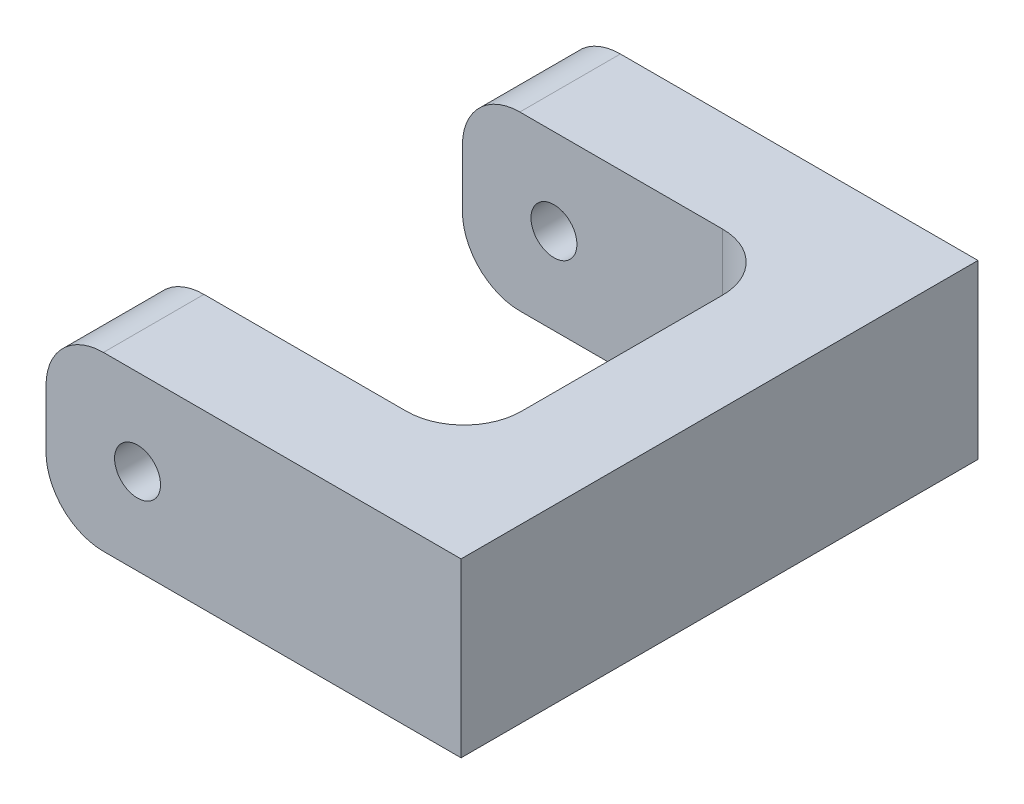
ISO-10303-21;
HEADER;
FILE_DESCRIPTION(('STEP AP214'),'2;1');
FILE_NAME('part.step','',(''),(''),'','','');
FILE_SCHEMA(('AUTOMOTIVE_DESIGN { 1 0 10303 214 1 1 1 1 }'));
ENDSEC;
DATA;
#1=APPLICATION_CONTEXT('core data for automotive mechanical design processes');
#2=APPLICATION_PROTOCOL_DEFINITION('international standard','automotive_design',2000,#1);
#3=PRODUCT_CONTEXT('',#1,'mechanical');
#4=PRODUCT('Part','Part','',(#3));
#5=PRODUCT_RELATED_PRODUCT_CATEGORY('part','',(#4));
#6=PRODUCT_DEFINITION_FORMATION('','',#4);
#7=PRODUCT_DEFINITION_CONTEXT('part definition',#1,'design');
#8=PRODUCT_DEFINITION('design','',#6,#7);
#9=PRODUCT_DEFINITION_SHAPE('','',#8);
#10=(LENGTH_UNIT() NAMED_UNIT(*) SI_UNIT(.MILLI.,.METRE.));
#11=(NAMED_UNIT(*) PLANE_ANGLE_UNIT() SI_UNIT($,.RADIAN.));
#12=(NAMED_UNIT(*) SI_UNIT($,.STERADIAN.) SOLID_ANGLE_UNIT());
#13=UNCERTAINTY_MEASURE_WITH_UNIT(LENGTH_MEASURE(1.E-05),#10,'distance_accuracy_value','');
#14=(GEOMETRIC_REPRESENTATION_CONTEXT(3) GLOBAL_UNCERTAINTY_ASSIGNED_CONTEXT((#13)) GLOBAL_UNIT_ASSIGNED_CONTEXT((#10,
#11,#12)) REPRESENTATION_CONTEXT('',''));
#15=CARTESIAN_POINT('',(0.,0.,0.));
#16=DIRECTION('',(0.,0.,1.));
#17=DIRECTION('',(1.,0.,0.));
#18=AXIS2_PLACEMENT_3D('',#15,#16,#17);
#19=CARTESIAN_POINT('',(9.88514391780015,-4.0419007614435,-71.));
#20=DIRECTION('',(0.,0.,1.));
#21=DIRECTION('',(1.,0.,0.));
#22=AXIS2_PLACEMENT_3D('',#19,#20,#21);
#23=CYLINDRICAL_SURFACE('',#22,10.);
#24=CARTESIAN_POINT('',(9.88514391780015,-4.0419007614435,-53.5));
#25=DIRECTION('',(0.,0.,-1.));
#26=DIRECTION('',(-1.,0.,0.));
#27=AXIS2_PLACEMENT_3D('',#24,#25,#26);
#28=CIRCLE('',#27,10.);
#29=CARTESIAN_POINT('',(9.88514391780022,5.9580992385565,-53.5));
#30=VERTEX_POINT('',#29);
#31=CARTESIAN_POINT('',(-0.11485608219985,-4.04190076144357,-53.5));
#32=VERTEX_POINT('',#31);
#33=EDGE_CURVE('E210',#30,#32,#28,.F.);
#34=ORIENTED_EDGE('',*,*,#33,.F.);
#35=DIRECTION('',(0.,0.,1.));
#36=VECTOR('',#35,1.);
#37=CARTESIAN_POINT('',(9.88514391780022,5.9580992385565,-71.));
#38=LINE('',#37,#36);
#39=CARTESIAN_POINT('',(9.88514391780022,5.9580992385565,-71.));
#40=VERTEX_POINT('',#39);
#41=EDGE_CURVE('E142',#40,#30,#38,.T.);
#42=ORIENTED_EDGE('',*,*,#41,.F.);
#43=CARTESIAN_POINT('',(9.88514391780015,-4.0419007614435,-71.));
#44=DIRECTION('',(0.,0.,1.));
#45=DIRECTION('',(-1.,0.,0.));
#46=AXIS2_PLACEMENT_3D('',#43,#44,#45);
#47=CIRCLE('',#46,10.);
#48=CARTESIAN_POINT('',(-0.11485608219985,-4.04190076144357,-71.));
#49=VERTEX_POINT('',#48);
#50=EDGE_CURVE('E217',#40,#49,#47,.T.);
#51=ORIENTED_EDGE('',*,*,#50,.T.);
#52=DIRECTION('',(0.,0.,1.));
#53=VECTOR('',#52,1.);
#54=CARTESIAN_POINT('',(-0.11485608219985,-4.04190076144357,-71.));
#55=LINE('',#54,#53);
#56=EDGE_CURVE('E158',#49,#32,#55,.T.);
#57=ORIENTED_EDGE('',*,*,#56,.T.);
#58=EDGE_LOOP('',(#34,#42,#51,#57));
#59=FACE_BOUND('',#58,.T.);
#60=ADVANCED_FACE('F30',(#59),#23,.T.);
#61=CARTESIAN_POINT('',(9.88514391780015,-14.0419007614435,-71.));
#62=DIRECTION('',(0.,0.,1.));
#63=DIRECTION('',(1.,0.,0.));
#64=AXIS2_PLACEMENT_3D('',#61,#62,#63);
#65=CYLINDRICAL_SURFACE('',#64,10.);
#66=CARTESIAN_POINT('',(9.88514391780015,-14.0419007614435,-53.5));
#67=DIRECTION('',(0.,0.,-1.));
#68=DIRECTION('',(-1.,0.,0.));
#69=AXIS2_PLACEMENT_3D('',#66,#67,#68);
#70=CIRCLE('',#69,10.);
#71=CARTESIAN_POINT('',(-0.114856082199849,-14.0419007614434,-53.5));
#72=VERTEX_POINT('',#71);
#73=CARTESIAN_POINT('',(9.88514391780022,-24.0419007614435,-53.5));
#74=VERTEX_POINT('',#73);
#75=EDGE_CURVE('E208',#72,#74,#70,.F.);
#76=ORIENTED_EDGE('',*,*,#75,.F.);
#77=DIRECTION('',(0.,0.,1.));
#78=VECTOR('',#77,1.);
#79=CARTESIAN_POINT('',(-0.114856082199849,-14.0419007614434,-71.));
#80=LINE('',#79,#78);
#81=CARTESIAN_POINT('',(-0.114856082199849,-14.0419007614434,-71.));
#82=VERTEX_POINT('',#81);
#83=EDGE_CURVE('E167',#82,#72,#80,.T.);
#84=ORIENTED_EDGE('',*,*,#83,.F.);
#85=CARTESIAN_POINT('',(9.88514391780015,-14.0419007614435,-71.));
#86=DIRECTION('',(0.,0.,1.));
#87=DIRECTION('',(1.,0.,0.));
#88=AXIS2_PLACEMENT_3D('',#85,#86,#87);
#89=CIRCLE('',#88,10.);
#90=CARTESIAN_POINT('',(9.88514391780022,-24.0419007614435,-71.));
#91=VERTEX_POINT('',#90);
#92=EDGE_CURVE('E224',#82,#91,#89,.T.);
#93=ORIENTED_EDGE('',*,*,#92,.T.);
#94=DIRECTION('',(0.,0.,1.));
#95=VECTOR('',#94,1.);
#96=CARTESIAN_POINT('',(9.88514391780022,-24.0419007614435,-71.));
#97=LINE('',#96,#95);
#98=EDGE_CURVE('E249',#91,#74,#97,.T.);
#99=ORIENTED_EDGE('',*,*,#98,.T.);
#100=EDGE_LOOP('',(#76,#84,#93,#99));
#101=FACE_BOUND('',#100,.T.);
#102=ADVANCED_FACE('F292',(#101),#65,.T.);
#103=CARTESIAN_POINT('',(-0.11485608219985,-4.04190076144357,-71.));
#104=DIRECTION('',(-1.,0.,0.));
#105=DIRECTION('',(0.,-1.,0.));
#106=AXIS2_PLACEMENT_3D('',#103,#104,#105);
#107=PLANE('',#106);
#108=DIRECTION('',(0.,-1.,0.));
#109=VECTOR('',#108,1.);
#110=CARTESIAN_POINT('',(-0.11485608219985,-4.04190076144357,-53.5));
#111=LINE('',#110,#109);
#112=EDGE_CURVE('E141',#32,#72,#111,.T.);
#113=ORIENTED_EDGE('',*,*,#112,.F.);
#114=ORIENTED_EDGE('',*,*,#56,.F.);
#115=DIRECTION('',(0.,-1.,0.));
#116=VECTOR('',#115,1.);
#117=CARTESIAN_POINT('',(-0.11485608219985,-4.04190076144357,-71.));
#118=LINE('',#117,#116);
#119=EDGE_CURVE('E220',#49,#82,#118,.T.);
#120=ORIENTED_EDGE('',*,*,#119,.T.);
#121=ORIENTED_EDGE('',*,*,#83,.T.);
#122=EDGE_LOOP('',(#113,#114,#120,#121));
#123=FACE_BOUND('',#122,.T.);
#124=ADVANCED_FACE('F298',(#123),#107,.T.);
#125=CARTESIAN_POINT('',(9.88514391780015,-4.0419007614435,1.5));
#126=DIRECTION('',(0.,0.,1.));
#127=DIRECTION('',(1.,0.,0.));
#128=AXIS2_PLACEMENT_3D('',#125,#126,#127);
#129=CIRCLE('',#128,10.);
#130=CARTESIAN_POINT('',(-0.11485608219985,-4.04190076144357,1.50000000000002));
#131=VERTEX_POINT('',#130);
#132=CARTESIAN_POINT('',(9.88514391780022,5.9580992385565,1.5));
#133=VERTEX_POINT('',#132);
#134=EDGE_CURVE('E134',#131,#133,#129,.F.);
#135=ORIENTED_EDGE('',*,*,#134,.F.);
#136=CARTESIAN_POINT('',(-0.11485608219985,-4.04190076144357,19.));
#137=VERTEX_POINT('',#136);
#138=EDGE_CURVE('E148',#131,#137,#55,.T.);
#139=ORIENTED_EDGE('',*,*,#138,.T.);
#140=CARTESIAN_POINT('',(9.88514391780015,-4.0419007614435,19.));
#141=DIRECTION('',(0.,0.,1.));
#142=DIRECTION('',(-1.,0.,0.));
#143=AXIS2_PLACEMENT_3D('',#140,#141,#142);
#144=CIRCLE('',#143,10.);
#145=CARTESIAN_POINT('',(9.88514391780022,5.9580992385565,19.));
#146=VERTEX_POINT('',#145);
#147=EDGE_CURVE('E201',#146,#137,#144,.T.);
#148=ORIENTED_EDGE('',*,*,#147,.F.);
#149=EDGE_CURVE('E150',#133,#146,#38,.T.);
#150=ORIENTED_EDGE('',*,*,#149,.F.);
#151=EDGE_LOOP('',(#135,#139,#148,#150));
#152=FACE_BOUND('',#151,.T.);
#153=ADVANCED_FACE('F146',(#152),#23,.T.);
#154=CARTESIAN_POINT('',(9.88514391780022,5.9580992385565,-71.));
#155=DIRECTION('',(0.,1.,0.));
#156=DIRECTION('',(0.,0.,1.));
#157=AXIS2_PLACEMENT_3D('',#154,#155,#156);
#158=PLANE('',#157);
#159=DIRECTION('',(-1.,0.,0.));
#160=VECTOR('',#159,1.);
#161=CARTESIAN_POINT('',(9.88514391780022,5.9580992385565,-53.5));
#162=LINE('',#161,#160);
#163=CARTESIAN_POINT('',(45.1526975354639,5.9580992385565,-53.5));
#164=VERTEX_POINT('',#163);
#165=EDGE_CURVE('E197',#164,#30,#162,.T.);
#166=ORIENTED_EDGE('',*,*,#165,.F.);
#167=CARTESIAN_POINT('',(45.1526975354639,5.9580992385565,-43.5));
#168=DIRECTION('',(0.,1.,0.));
#169=DIRECTION('',(0.,0.,1.));
#170=AXIS2_PLACEMENT_3D('',#167,#168,#169);
#171=CIRCLE('',#170,10.);
#172=CARTESIAN_POINT('',(55.1526975354639,5.9580992385565,-43.5));
#173=VERTEX_POINT('',#172);
#174=EDGE_CURVE('E38',#164,#173,#171,.F.);
#175=ORIENTED_EDGE('',*,*,#174,.T.);
#176=DIRECTION('',(0.,0.,-1.));
#177=VECTOR('',#176,1.);
#178=CARTESIAN_POINT('',(55.1526975354639,5.9580992385565,-71.));
#179=LINE('',#178,#177);
#180=CARTESIAN_POINT('',(55.1526975354639,5.9580992385565,-8.5));
#181=VERTEX_POINT('',#180);
#182=EDGE_CURVE('E195',#181,#173,#179,.T.);
#183=ORIENTED_EDGE('',*,*,#182,.F.);
#184=CARTESIAN_POINT('',(45.1526975354639,5.9580992385565,-8.5));
#185=DIRECTION('',(0.,1.,0.));
#186=DIRECTION('',(0.,0.,1.));
#187=AXIS2_PLACEMENT_3D('',#184,#185,#186);
#188=CIRCLE('',#187,10.);
#189=CARTESIAN_POINT('',(45.1526975354639,5.9580992385565,1.5));
#190=VERTEX_POINT('',#189);
#191=EDGE_CURVE('E187',#181,#190,#188,.F.);
#192=ORIENTED_EDGE('',*,*,#191,.T.);
#193=DIRECTION('',(1.,0.,0.));
#194=VECTOR('',#193,1.);
#195=CARTESIAN_POINT('',(9.88514391780023,5.9580992385565,1.5));
#196=LINE('',#195,#194);
#197=EDGE_CURVE('E151',#133,#190,#196,.T.);
#198=ORIENTED_EDGE('',*,*,#197,.F.);
#199=ORIENTED_EDGE('',*,*,#149,.T.);
#200=DIRECTION('',(-1.,0.,0.));
#201=VECTOR('',#200,1.);
#202=CARTESIAN_POINT('',(9.88514391780022,5.9580992385565,19.));
#203=LINE('',#202,#201);
#204=CARTESIAN_POINT('',(72.1526975354639,5.9580992385565,19.));
#205=VERTEX_POINT('',#204);
#206=EDGE_CURVE('E221',#205,#146,#203,.T.);
#207=ORIENTED_EDGE('',*,*,#206,.F.);
#208=DIRECTION('',(0.,0.,1.));
#209=VECTOR('',#208,1.);
#210=CARTESIAN_POINT('',(72.1526975354639,5.9580992385565,-71.));
#211=LINE('',#210,#209);
#212=CARTESIAN_POINT('',(72.1526975354639,5.9580992385565,-71.));
#213=VERTEX_POINT('',#212);
#214=EDGE_CURVE('E246',#213,#205,#211,.T.);
#215=ORIENTED_EDGE('',*,*,#214,.F.);
#216=DIRECTION('',(-1.,0.,0.));
#217=VECTOR('',#216,1.);
#218=CARTESIAN_POINT('',(9.88514391780022,5.9580992385565,-71.));
#219=LINE('',#218,#217);
#220=EDGE_CURVE('E159',#213,#40,#219,.T.);
#221=ORIENTED_EDGE('',*,*,#220,.T.);
#222=ORIENTED_EDGE('',*,*,#41,.T.);
#223=EDGE_LOOP('',(#166,#175,#183,#192,#198,#199,#207,#215,#221,#222));
#224=FACE_BOUND('',#223,.T.);
#225=ADVANCED_FACE('F194',(#224),#158,.T.);
#226=CARTESIAN_POINT('',(72.1526975354639,5.9580992385565,-71.));
#227=DIRECTION('',(1.,0.,0.));
#228=DIRECTION('',(0.,0.,-1.));
#229=AXIS2_PLACEMENT_3D('',#226,#227,#228);
#230=PLANE('',#229);
#231=DIRECTION('',(0.,1.,0.));
#232=VECTOR('',#231,1.);
#233=CARTESIAN_POINT('',(72.1526975354639,5.9580992385565,19.));
#234=LINE('',#233,#232);
#235=CARTESIAN_POINT('',(72.1526975354639,-24.0419007614435,19.));
#236=VERTEX_POINT('',#235);
#237=EDGE_CURVE('E240',#236,#205,#234,.T.);
#238=ORIENTED_EDGE('',*,*,#237,.F.);
#239=DIRECTION('',(0.,0.,1.));
#240=VECTOR('',#239,1.);
#241=CARTESIAN_POINT('',(72.1526975354639,-24.0419007614435,-71.));
#242=LINE('',#241,#240);
#243=CARTESIAN_POINT('',(72.1526975354639,-24.0419007614435,-71.));
#244=VERTEX_POINT('',#243);
#245=EDGE_CURVE('E248',#244,#236,#242,.T.);
#246=ORIENTED_EDGE('',*,*,#245,.F.);
#247=DIRECTION('',(0.,1.,0.));
#248=VECTOR('',#247,1.);
#249=CARTESIAN_POINT('',(72.1526975354639,5.9580992385565,-71.));
#250=LINE('',#249,#248);
#251=EDGE_CURVE('E164',#244,#213,#250,.T.);
#252=ORIENTED_EDGE('',*,*,#251,.T.);
#253=ORIENTED_EDGE('',*,*,#214,.T.);
#254=EDGE_LOOP('',(#238,#246,#252,#253));
#255=FACE_BOUND('',#254,.T.);
#256=ADVANCED_FACE('F306',(#255),#230,.T.);
#257=CARTESIAN_POINT('',(9.88514391780022,-24.0419007614435,-71.));
#258=DIRECTION('',(0.,-1.,0.));
#259=DIRECTION('',(0.,0.,-1.));
#260=AXIS2_PLACEMENT_3D('',#257,#258,#259);
#261=PLANE('',#260);
#262=DIRECTION('',(1.,0.,0.));
#263=VECTOR('',#262,1.);
#264=CARTESIAN_POINT('',(9.88514391780022,-24.0419007614435,-53.5));
#265=LINE('',#264,#263);
#266=CARTESIAN_POINT('',(45.1526975354639,-24.0419007614435,-53.5));
#267=VERTEX_POINT('',#266);
#268=EDGE_CURVE('E206',#74,#267,#265,.T.);
#269=ORIENTED_EDGE('',*,*,#268,.F.);
#270=ORIENTED_EDGE('',*,*,#98,.F.);
#271=DIRECTION('',(1.,0.,0.));
#272=VECTOR('',#271,1.);
#273=CARTESIAN_POINT('',(9.88514391780022,-24.0419007614435,-71.));
#274=LINE('',#273,#272);
#275=EDGE_CURVE('E227',#91,#244,#274,.T.);
#276=ORIENTED_EDGE('',*,*,#275,.T.);
#277=ORIENTED_EDGE('',*,*,#245,.T.);
#278=DIRECTION('',(1.,0.,0.));
#279=VECTOR('',#278,1.);
#280=CARTESIAN_POINT('',(9.88514391780022,-24.0419007614435,19.));
#281=LINE('',#280,#279);
#282=CARTESIAN_POINT('',(9.88514391780022,-24.0419007614435,19.));
#283=VERTEX_POINT('',#282);
#284=EDGE_CURVE('E237',#283,#236,#281,.T.);
#285=ORIENTED_EDGE('',*,*,#284,.F.);
#286=CARTESIAN_POINT('',(9.88514391780022,-24.0419007614435,1.5));
#287=VERTEX_POINT('',#286);
#288=EDGE_CURVE('E250',#287,#283,#97,.T.);
#289=ORIENTED_EDGE('',*,*,#288,.F.);
#290=DIRECTION('',(-1.,0.,0.));
#291=VECTOR('',#290,1.);
#292=CARTESIAN_POINT('',(9.88514391780023,-24.0419007614435,1.5));
#293=LINE('',#292,#291);
#294=CARTESIAN_POINT('',(45.1526975354639,-24.0419007614435,1.5));
#295=VERTEX_POINT('',#294);
#296=EDGE_CURVE('E152',#295,#287,#293,.T.);
#297=ORIENTED_EDGE('',*,*,#296,.F.);
#298=CARTESIAN_POINT('',(45.1526975354639,-24.0419007614435,-8.5));
#299=DIRECTION('',(0.,-1.,0.));
#300=DIRECTION('',(0.,0.,-1.));
#301=AXIS2_PLACEMENT_3D('',#298,#299,#300);
#302=CIRCLE('',#301,10.);
#303=CARTESIAN_POINT('',(55.1526975354639,-24.0419007614435,-8.5));
#304=VERTEX_POINT('',#303);
#305=EDGE_CURVE('E189',#295,#304,#302,.F.);
#306=ORIENTED_EDGE('',*,*,#305,.T.);
#307=DIRECTION('',(0.,0.,1.));
#308=VECTOR('',#307,1.);
#309=CARTESIAN_POINT('',(55.1526975354639,-24.0419007614435,-71.));
#310=LINE('',#309,#308);
#311=CARTESIAN_POINT('',(55.1526975354639,-24.0419007614435,-43.5));
#312=VERTEX_POINT('',#311);
#313=EDGE_CURVE('E171',#312,#304,#310,.T.);
#314=ORIENTED_EDGE('',*,*,#313,.F.);
#315=CARTESIAN_POINT('',(45.1526975354639,-24.0419007614435,-43.5));
#316=DIRECTION('',(0.,-1.,0.));
#317=DIRECTION('',(0.,0.,-1.));
#318=AXIS2_PLACEMENT_3D('',#315,#316,#317);
#319=CIRCLE('',#318,10.);
#320=EDGE_CURVE('E11',#312,#267,#319,.F.);
#321=ORIENTED_EDGE('',*,*,#320,.T.);
#322=EDGE_LOOP('',(#269,#270,#276,#277,#285,#289,#297,#306,#314,#321));
#323=FACE_BOUND('',#322,.T.);
#324=ADVANCED_FACE('F318',(#323),#261,.T.);
#325=CARTESIAN_POINT('',(9.88514391780015,-14.0419007614435,1.5));
#326=DIRECTION('',(0.,0.,1.));
#327=DIRECTION('',(1.,0.,0.));
#328=AXIS2_PLACEMENT_3D('',#325,#326,#327);
#329=CIRCLE('',#328,10.);
#330=CARTESIAN_POINT('',(-0.114856082199849,-14.0419007614434,1.49999999999999));
#331=VERTEX_POINT('',#330);
#332=EDGE_CURVE('E137',#287,#331,#329,.F.);
#333=ORIENTED_EDGE('',*,*,#332,.F.);
#334=ORIENTED_EDGE('',*,*,#288,.T.);
#335=CARTESIAN_POINT('',(9.88514391780015,-14.0419007614435,19.));
#336=DIRECTION('',(0.,0.,1.));
#337=DIRECTION('',(1.,0.,0.));
#338=AXIS2_PLACEMENT_3D('',#335,#336,#337);
#339=CIRCLE('',#338,10.);
#340=CARTESIAN_POINT('',(-0.114856082199849,-14.0419007614434,19.));
#341=VERTEX_POINT('',#340);
#342=EDGE_CURVE('E234',#341,#283,#339,.T.);
#343=ORIENTED_EDGE('',*,*,#342,.F.);
#344=EDGE_CURVE('E162',#331,#341,#80,.T.);
#345=ORIENTED_EDGE('',*,*,#344,.F.);
#346=EDGE_LOOP('',(#333,#334,#343,#345));
#347=FACE_BOUND('',#346,.T.);
#348=ADVANCED_FACE('F259',(#347),#65,.T.);
#349=DIRECTION('',(0.,1.,0.));
#350=VECTOR('',#349,1.);
#351=CARTESIAN_POINT('',(-0.11485608219985,-4.04190076144357,1.50000000000002));
#352=LINE('',#351,#350);
#353=EDGE_CURVE('E130',#331,#131,#352,.T.);
#354=ORIENTED_EDGE('',*,*,#353,.F.);
#355=ORIENTED_EDGE('',*,*,#344,.T.);
#356=DIRECTION('',(0.,-1.,0.));
#357=VECTOR('',#356,1.);
#358=CARTESIAN_POINT('',(-0.11485608219985,-4.04190076144357,19.));
#359=LINE('',#358,#357);
#360=EDGE_CURVE('E156',#137,#341,#359,.T.);
#361=ORIENTED_EDGE('',*,*,#360,.F.);
#362=ORIENTED_EDGE('',*,*,#138,.F.);
#363=EDGE_LOOP('',(#354,#355,#361,#362));
#364=FACE_BOUND('',#363,.T.);
#365=ADVANCED_FACE('F154',(#364),#107,.T.);
#366=CARTESIAN_POINT('',(9.88514391780015,-4.0419007614435,-71.));
#367=DIRECTION('',(0.,0.,-1.));
#368=DIRECTION('',(-1.,0.,0.));
#369=AXIS2_PLACEMENT_3D('',#366,#367,#368);
#370=PLANE('',#369);
#371=CARTESIAN_POINT('',(15.8239530552189,-9.0419007614435,-71.));
#372=DIRECTION('',(0.,0.,-1.));
#373=DIRECTION('',(-1.,0.,0.));
#374=AXIS2_PLACEMENT_3D('',#371,#372,#373);
#375=CIRCLE('',#374,4.);
#376=CARTESIAN_POINT('',(11.8239530552189,-9.0419007614435,-71.));
#377=VERTEX_POINT('',#376);
#378=EDGE_CURVE('E268',#377,#377,#375,.T.);
#379=ORIENTED_EDGE('',*,*,#378,.F.);
#380=EDGE_LOOP('',(#379));
#381=FACE_BOUND('',#380,.T.);
#382=ORIENTED_EDGE('',*,*,#50,.F.);
#383=ORIENTED_EDGE('',*,*,#220,.F.);
#384=ORIENTED_EDGE('',*,*,#251,.F.);
#385=ORIENTED_EDGE('',*,*,#275,.F.);
#386=ORIENTED_EDGE('',*,*,#92,.F.);
#387=ORIENTED_EDGE('',*,*,#119,.F.);
#388=EDGE_LOOP('',(#382,#383,#384,#385,#386,#387));
#389=FACE_BOUND('',#388,.T.);
#390=ADVANCED_FACE('F311',(#381,#389),#370,.T.);
#391=CARTESIAN_POINT('',(9.88514391780015,-4.0419007614435,19.));
#392=DIRECTION('',(0.,0.,-1.));
#393=DIRECTION('',(-1.,0.,0.));
#394=AXIS2_PLACEMENT_3D('',#391,#392,#393);
#395=PLANE('',#394);
#396=CARTESIAN_POINT('',(15.8239530552189,-9.0419007614435,19.));
#397=DIRECTION('',(0.,0.,-1.));
#398=DIRECTION('',(-1.,0.,0.));
#399=AXIS2_PLACEMENT_3D('',#396,#397,#398);
#400=CIRCLE('',#399,4.);
#401=CARTESIAN_POINT('',(11.8239530552189,-9.0419007614435,19.));
#402=VERTEX_POINT('',#401);
#403=EDGE_CURVE('E271',#402,#402,#400,.T.);
#404=ORIENTED_EDGE('',*,*,#403,.T.);
#405=EDGE_LOOP('',(#404));
#406=FACE_BOUND('',#405,.T.);
#407=ORIENTED_EDGE('',*,*,#147,.T.);
#408=ORIENTED_EDGE('',*,*,#360,.T.);
#409=ORIENTED_EDGE('',*,*,#342,.T.);
#410=ORIENTED_EDGE('',*,*,#284,.T.);
#411=ORIENTED_EDGE('',*,*,#237,.T.);
#412=ORIENTED_EDGE('',*,*,#206,.T.);
#413=EDGE_LOOP('',(#407,#408,#409,#410,#411,#412));
#414=FACE_BOUND('',#413,.T.);
#415=ADVANCED_FACE('F261',(#406,#414),#395,.F.);
#416=CARTESIAN_POINT('',(-2.26609945987824,-43.5,-53.5));
#417=DIRECTION('',(0.,0.,-1.));
#418=DIRECTION('',(-1.,0.,0.));
#419=AXIS2_PLACEMENT_3D('',#416,#417,#418);
#420=PLANE('',#419);
#421=CARTESIAN_POINT('',(15.8239530552189,-9.0419007614435,-53.5));
#422=DIRECTION('',(0.,0.,-1.));
#423=DIRECTION('',(-1.,0.,0.));
#424=AXIS2_PLACEMENT_3D('',#421,#422,#423);
#425=CIRCLE('',#424,4.);
#426=CARTESIAN_POINT('',(11.8239530552189,-9.0419007614435,-53.5));
#427=VERTEX_POINT('',#426);
#428=EDGE_CURVE('E178',#427,#427,#425,.T.);
#429=ORIENTED_EDGE('',*,*,#428,.T.);
#430=EDGE_LOOP('',(#429));
#431=FACE_BOUND('',#430,.T.);
#432=ORIENTED_EDGE('',*,*,#268,.T.);
#433=DIRECTION('',(0.,1.,0.));
#434=VECTOR('',#433,1.);
#435=CARTESIAN_POINT('',(45.1526975354639,5.9580992385565,-53.5));
#436=LINE('',#435,#434);
#437=EDGE_CURVE('E185',#267,#164,#436,.T.);
#438=ORIENTED_EDGE('',*,*,#437,.T.);
#439=ORIENTED_EDGE('',*,*,#165,.T.);
#440=ORIENTED_EDGE('',*,*,#33,.T.);
#441=ORIENTED_EDGE('',*,*,#112,.T.);
#442=ORIENTED_EDGE('',*,*,#75,.T.);
#443=EDGE_LOOP('',(#432,#438,#439,#440,#441,#442));
#444=FACE_BOUND('',#443,.T.);
#445=ADVANCED_FACE('F204',(#431,#444),#420,.F.);
#446=CARTESIAN_POINT('',(55.1526975354639,-43.5,-53.5));
#447=DIRECTION('',(1.,0.,0.));
#448=DIRECTION('',(0.,0.,-1.));
#449=AXIS2_PLACEMENT_3D('',#446,#447,#448);
#450=PLANE('',#449);
#451=ORIENTED_EDGE('',*,*,#313,.T.);
#452=DIRECTION('',(0.,1.,0.));
#453=VECTOR('',#452,1.);
#454=CARTESIAN_POINT('',(55.1526975354639,5.9580992385565,-8.5));
#455=LINE('',#454,#453);
#456=EDGE_CURVE('E180',#304,#181,#455,.T.);
#457=ORIENTED_EDGE('',*,*,#456,.T.);
#458=ORIENTED_EDGE('',*,*,#182,.T.);
#459=DIRECTION('',(0.,1.,0.));
#460=VECTOR('',#459,1.);
#461=CARTESIAN_POINT('',(55.1526975354639,-24.0419007614435,-43.5));
#462=LINE('',#461,#460);
#463=EDGE_CURVE('E174',#173,#312,#462,.F.);
#464=ORIENTED_EDGE('',*,*,#463,.T.);
#465=EDGE_LOOP('',(#451,#457,#458,#464));
#466=FACE_BOUND('',#465,.T.);
#467=ADVANCED_FACE('F199',(#466),#450,.F.);
#468=CARTESIAN_POINT('',(55.1526975354639,-43.5,1.5));
#469=DIRECTION('',(0.,0.,1.));
#470=DIRECTION('',(1.,0.,0.));
#471=AXIS2_PLACEMENT_3D('',#468,#469,#470);
#472=PLANE('',#471);
#473=CARTESIAN_POINT('',(15.8239530552189,-9.0419007614435,1.5));
#474=DIRECTION('',(0.,0.,1.));
#475=DIRECTION('',(1.,0.,0.));
#476=AXIS2_PLACEMENT_3D('',#473,#474,#475);
#477=CIRCLE('',#476,4.);
#478=CARTESIAN_POINT('',(19.8239530552189,-9.0419007614435,1.5));
#479=VERTEX_POINT('',#478);
#480=EDGE_CURVE('E175',#479,#479,#477,.T.);
#481=ORIENTED_EDGE('',*,*,#480,.T.);
#482=EDGE_LOOP('',(#481));
#483=FACE_BOUND('',#482,.T.);
#484=ORIENTED_EDGE('',*,*,#197,.T.);
#485=DIRECTION('',(0.,1.,0.));
#486=VECTOR('',#485,1.);
#487=CARTESIAN_POINT('',(45.1526975354639,-24.0419007614435,1.5));
#488=LINE('',#487,#486);
#489=EDGE_CURVE('E183',#190,#295,#488,.F.);
#490=ORIENTED_EDGE('',*,*,#489,.T.);
#491=ORIENTED_EDGE('',*,*,#296,.T.);
#492=ORIENTED_EDGE('',*,*,#332,.T.);
#493=ORIENTED_EDGE('',*,*,#353,.T.);
#494=ORIENTED_EDGE('',*,*,#134,.T.);
#495=EDGE_LOOP('',(#484,#490,#491,#492,#493,#494));
#496=FACE_BOUND('',#495,.T.);
#497=ADVANCED_FACE('F133',(#483,#496),#472,.F.);
#498=CARTESIAN_POINT('',(15.8239530552189,-9.0419007614435,-100.));
#499=DIRECTION('',(0.,0.,1.));
#500=DIRECTION('',(1.,0.,0.));
#501=AXIS2_PLACEMENT_3D('',#498,#499,#500);
#502=CYLINDRICAL_SURFACE('',#501,4.);
#503=ORIENTED_EDGE('',*,*,#480,.F.);
#504=EDGE_LOOP('',(#503));
#505=FACE_BOUND('',#504,.T.);
#506=ORIENTED_EDGE('',*,*,#403,.F.);
#507=EDGE_LOOP('',(#506));
#508=FACE_BOUND('',#507,.T.);
#509=ADVANCED_FACE('F281',(#505,#508),#502,.F.);
#510=ORIENTED_EDGE('',*,*,#378,.T.);
#511=EDGE_LOOP('',(#510));
#512=FACE_BOUND('',#511,.T.);
#513=ORIENTED_EDGE('',*,*,#428,.F.);
#514=EDGE_LOOP('',(#513));
#515=FACE_BOUND('',#514,.T.);
#516=ADVANCED_FACE('F278',(#512,#515),#502,.F.);
#517=CARTESIAN_POINT('',(45.1526975354639,-43.5,-8.5));
#518=DIRECTION('',(0.,-1.,0.));
#519=DIRECTION('',(0.,0.,-1.));
#520=AXIS2_PLACEMENT_3D('',#517,#518,#519);
#521=CYLINDRICAL_SURFACE('',#520,10.);
#522=ORIENTED_EDGE('',*,*,#305,.F.);
#523=ORIENTED_EDGE('',*,*,#489,.F.);
#524=ORIENTED_EDGE('',*,*,#191,.F.);
#525=ORIENTED_EDGE('',*,*,#456,.F.);
#526=EDGE_LOOP('',(#522,#523,#524,#525));
#527=FACE_BOUND('',#526,.T.);
#528=ADVANCED_FACE('F280',(#527),#521,.F.);
#529=CARTESIAN_POINT('',(45.1526975354639,-43.5,-43.5));
#530=DIRECTION('',(0.,-1.,0.));
#531=DIRECTION('',(0.,0.,-1.));
#532=AXIS2_PLACEMENT_3D('',#529,#530,#531);
#533=CYLINDRICAL_SURFACE('',#532,10.);
#534=ORIENTED_EDGE('',*,*,#320,.F.);
#535=ORIENTED_EDGE('',*,*,#463,.F.);
#536=ORIENTED_EDGE('',*,*,#174,.F.);
#537=ORIENTED_EDGE('',*,*,#437,.F.);
#538=EDGE_LOOP('',(#534,#535,#536,#537));
#539=FACE_BOUND('',#538,.T.);
#540=ADVANCED_FACE('F32',(#539),#533,.F.);
#541=CLOSED_SHELL('',(#60,#102,#124,#153,#225,#256,#324,#348,#365,#390,#415,#445,#467,#497,#509,
#516,#528,#540));
#542=MANIFOLD_SOLID_BREP('B2',#541);
#543=ADVANCED_BREP_SHAPE_REPRESENTATION('',(#18,#542),#14);
#544=SHAPE_DEFINITION_REPRESENTATION(#9,#543);
ENDSEC;
END-ISO-10303-21;
